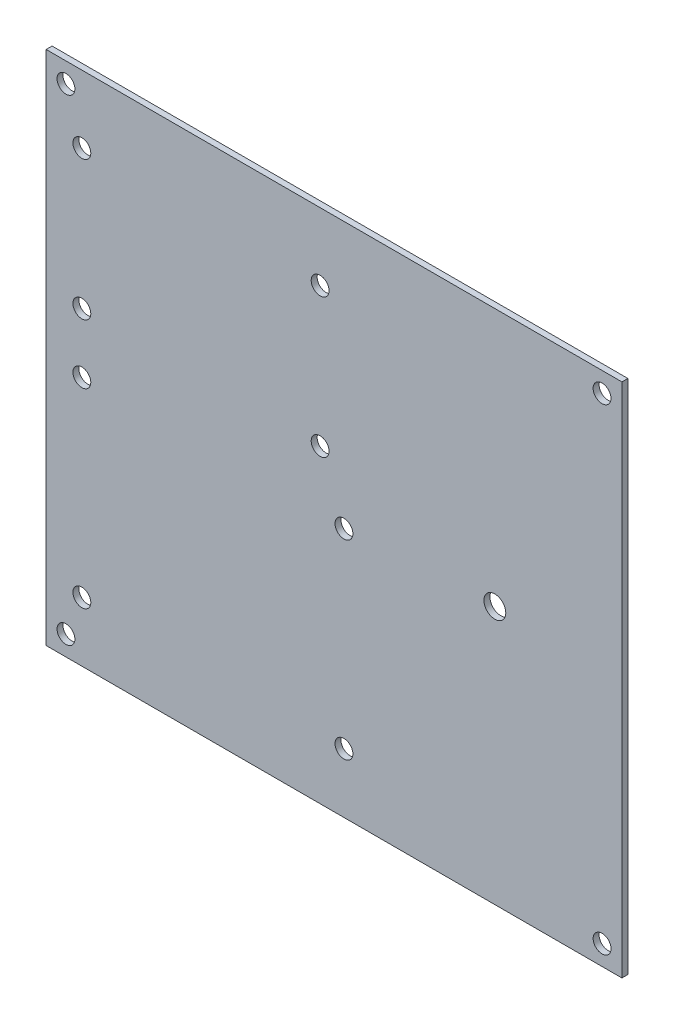
ISO-10303-21;
HEADER;
FILE_DESCRIPTION(('STEP AP214'),'2;1');
FILE_NAME('part.step','',(''),(''),'','','');
FILE_SCHEMA(('AUTOMOTIVE_DESIGN { 1 0 10303 214 1 1 1 1 }'));
ENDSEC;
DATA;
#1=APPLICATION_CONTEXT('core data for automotive mechanical design processes');
#2=APPLICATION_PROTOCOL_DEFINITION('international standard','automotive_design',2000,#1);
#3=PRODUCT_CONTEXT('',#1,'mechanical');
#4=PRODUCT('Part','Part','',(#3));
#5=PRODUCT_RELATED_PRODUCT_CATEGORY('part','',(#4));
#6=PRODUCT_DEFINITION_FORMATION('','',#4);
#7=PRODUCT_DEFINITION_CONTEXT('part definition',#1,'design');
#8=PRODUCT_DEFINITION('design','',#6,#7);
#9=PRODUCT_DEFINITION_SHAPE('','',#8);
#10=(LENGTH_UNIT() NAMED_UNIT(*) SI_UNIT(.MILLI.,.METRE.));
#11=(NAMED_UNIT(*) PLANE_ANGLE_UNIT() SI_UNIT($,.RADIAN.));
#12=(NAMED_UNIT(*) SI_UNIT($,.STERADIAN.) SOLID_ANGLE_UNIT());
#13=UNCERTAINTY_MEASURE_WITH_UNIT(LENGTH_MEASURE(1.E-05),#10,'distance_accuracy_value','');
#14=(GEOMETRIC_REPRESENTATION_CONTEXT(3) GLOBAL_UNCERTAINTY_ASSIGNED_CONTEXT((#13)) GLOBAL_UNIT_ASSIGNED_CONTEXT((#10,
#11,#12)) REPRESENTATION_CONTEXT('',''));
#15=CARTESIAN_POINT('',(0.,0.,0.));
#16=DIRECTION('',(0.,0.,1.));
#17=DIRECTION('',(1.,0.,0.));
#18=AXIS2_PLACEMENT_3D('',#15,#16,#17);
#19=CARTESIAN_POINT('',(-72.5,-65.,1.5));
#20=DIRECTION('',(0.,0.,-1.));
#21=DIRECTION('',(-1.,0.,0.));
#22=AXIS2_PLACEMENT_3D('',#19,#20,#21);
#23=PLANE('',#22);
#24=CARTESIAN_POINT('',(-3.49999999999999,13.,1.5));
#25=DIRECTION('',(0.,0.,1.));
#26=DIRECTION('',(1.,0.,0.));
#27=AXIS2_PLACEMENT_3D('',#24,#25,#26);
#28=CIRCLE('',#27,2.25);
#29=CARTESIAN_POINT('',(-1.24999999999999,13.,1.5));
#30=VERTEX_POINT('',#29);
#31=EDGE_CURVE('E175',#30,#30,#28,.T.);
#32=ORIENTED_EDGE('',*,*,#31,.F.);
#33=EDGE_LOOP('',(#32));
#34=FACE_BOUND('',#33,.T.);
#35=CARTESIAN_POINT('',(-63.5,13.,1.5));
#36=DIRECTION('',(0.,0.,1.));
#37=DIRECTION('',(1.,0.,0.));
#38=AXIS2_PLACEMENT_3D('',#35,#36,#37);
#39=CIRCLE('',#38,2.25);
#40=CARTESIAN_POINT('',(-61.25,13.,1.5));
#41=VERTEX_POINT('',#40);
#42=EDGE_CURVE('E163',#41,#41,#39,.T.);
#43=ORIENTED_EDGE('',*,*,#42,.F.);
#44=EDGE_LOOP('',(#43));
#45=FACE_BOUND('',#44,.T.);
#46=CARTESIAN_POINT('',(2.50000000000002,-50.,1.5));
#47=DIRECTION('',(0.,0.,1.));
#48=DIRECTION('',(-1.,0.,0.));
#49=AXIS2_PLACEMENT_3D('',#46,#47,#48);
#50=CIRCLE('',#49,2.25);
#51=CARTESIAN_POINT('',(0.250000000000013,-50.,1.5));
#52=VERTEX_POINT('',#51);
#53=EDGE_CURVE('E151',#52,#52,#50,.T.);
#54=ORIENTED_EDGE('',*,*,#53,.F.);
#55=EDGE_LOOP('',(#54));
#56=FACE_BOUND('',#55,.T.);
#57=CARTESIAN_POINT('',(-63.5,-50.,1.5));
#58=DIRECTION('',(0.,0.,1.));
#59=DIRECTION('',(-1.,0.,0.));
#60=AXIS2_PLACEMENT_3D('',#57,#58,#59);
#61=CIRCLE('',#60,2.25);
#62=CARTESIAN_POINT('',(-65.75,-50.,1.5));
#63=VERTEX_POINT('',#62);
#64=EDGE_CURVE('E139',#63,#63,#61,.T.);
#65=ORIENTED_EDGE('',*,*,#64,.F.);
#66=EDGE_LOOP('',(#65));
#67=FACE_BOUND('',#66,.T.);
#68=CARTESIAN_POINT('',(67.5,60.,1.5));
#69=DIRECTION('',(0.,0.,1.));
#70=DIRECTION('',(-1.,0.,0.));
#71=AXIS2_PLACEMENT_3D('',#68,#69,#70);
#72=CIRCLE('',#71,2.25);
#73=CARTESIAN_POINT('',(65.25,60.,1.5));
#74=VERTEX_POINT('',#73);
#75=EDGE_CURVE('E127',#74,#74,#72,.T.);
#76=ORIENTED_EDGE('',*,*,#75,.F.);
#77=EDGE_LOOP('',(#76));
#78=FACE_BOUND('',#77,.T.);
#79=CARTESIAN_POINT('',(-67.5,-60.,1.5));
#80=DIRECTION('',(0.,0.,1.));
#81=DIRECTION('',(-1.,0.,0.));
#82=AXIS2_PLACEMENT_3D('',#79,#80,#81);
#83=CIRCLE('',#82,2.25);
#84=CARTESIAN_POINT('',(-69.75,-60.,1.5));
#85=VERTEX_POINT('',#84);
#86=EDGE_CURVE('E115',#85,#85,#83,.T.);
#87=ORIENTED_EDGE('',*,*,#86,.F.);
#88=EDGE_LOOP('',(#87));
#89=FACE_BOUND('',#88,.T.);
#90=DIRECTION('',(0.,-1.,0.));
#91=VECTOR('',#90,1.);
#92=CARTESIAN_POINT('',(-72.5,-65.,1.5));
#93=LINE('',#92,#91);
#94=CARTESIAN_POINT('',(-72.5,65.,1.5));
#95=VERTEX_POINT('',#94);
#96=CARTESIAN_POINT('',(-72.5,-65.,1.5));
#97=VERTEX_POINT('',#96);
#98=EDGE_CURVE('E85',#95,#97,#93,.T.);
#99=ORIENTED_EDGE('',*,*,#98,.T.);
#100=DIRECTION('',(1.,0.,0.));
#101=VECTOR('',#100,1.);
#102=CARTESIAN_POINT('',(-72.5,-65.,1.5));
#103=LINE('',#102,#101);
#104=CARTESIAN_POINT('',(72.5,-65.,1.5));
#105=VERTEX_POINT('',#104);
#106=EDGE_CURVE('E80',#97,#105,#103,.T.);
#107=ORIENTED_EDGE('',*,*,#106,.T.);
#108=DIRECTION('',(0.,1.,0.));
#109=VECTOR('',#108,1.);
#110=CARTESIAN_POINT('',(72.5,-65.,1.5));
#111=LINE('',#110,#109);
#112=CARTESIAN_POINT('',(72.5,65.,1.5));
#113=VERTEX_POINT('',#112);
#114=EDGE_CURVE('E83',#105,#113,#111,.T.);
#115=ORIENTED_EDGE('',*,*,#114,.T.);
#116=DIRECTION('',(-1.,0.,0.));
#117=VECTOR('',#116,1.);
#118=CARTESIAN_POINT('',(-72.5,65.,1.5));
#119=LINE('',#118,#117);
#120=EDGE_CURVE('E50',#113,#95,#119,.T.);
#121=ORIENTED_EDGE('',*,*,#120,.T.);
#122=EDGE_LOOP('',(#99,#107,#115,#121));
#123=FACE_BOUND('',#122,.T.);
#124=CARTESIAN_POINT('',(-67.5,60.,1.5));
#125=DIRECTION('',(0.,0.,1.));
#126=DIRECTION('',(1.,0.,0.));
#127=AXIS2_PLACEMENT_3D('',#124,#125,#126);
#128=CIRCLE('',#127,2.25);
#129=CARTESIAN_POINT('',(-65.25,60.,1.5));
#130=VERTEX_POINT('',#129);
#131=EDGE_CURVE('E100',#130,#130,#128,.T.);
#132=ORIENTED_EDGE('',*,*,#131,.F.);
#133=EDGE_LOOP('',(#132));
#134=FACE_BOUND('',#133,.T.);
#135=CARTESIAN_POINT('',(67.5,-60.,1.5));
#136=DIRECTION('',(0.,0.,1.));
#137=DIRECTION('',(1.,0.,0.));
#138=AXIS2_PLACEMENT_3D('',#135,#136,#137);
#139=CIRCLE('',#138,2.25);
#140=CARTESIAN_POINT('',(69.75,-60.,1.5));
#141=VERTEX_POINT('',#140);
#142=EDGE_CURVE('E121',#141,#141,#139,.T.);
#143=ORIENTED_EDGE('',*,*,#142,.F.);
#144=EDGE_LOOP('',(#143));
#145=FACE_BOUND('',#144,.T.);
#146=CARTESIAN_POINT('',(-63.5,-2.00000000000001,1.5));
#147=DIRECTION('',(0.,0.,1.));
#148=DIRECTION('',(1.,0.,0.));
#149=AXIS2_PLACEMENT_3D('',#146,#147,#148);
#150=CIRCLE('',#149,2.25);
#151=CARTESIAN_POINT('',(-61.25,-2.00000000000001,1.5));
#152=VERTEX_POINT('',#151);
#153=EDGE_CURVE('E133',#152,#152,#150,.T.);
#154=ORIENTED_EDGE('',*,*,#153,.F.);
#155=EDGE_LOOP('',(#154));
#156=FACE_BOUND('',#155,.T.);
#157=CARTESIAN_POINT('',(2.50000000000002,-2.,1.5));
#158=DIRECTION('',(0.,0.,1.));
#159=DIRECTION('',(1.,0.,0.));
#160=AXIS2_PLACEMENT_3D('',#157,#158,#159);
#161=CIRCLE('',#160,2.25);
#162=CARTESIAN_POINT('',(4.75000000000001,-2.,1.5));
#163=VERTEX_POINT('',#162);
#164=EDGE_CURVE('E145',#163,#163,#161,.T.);
#165=ORIENTED_EDGE('',*,*,#164,.F.);
#166=EDGE_LOOP('',(#165));
#167=FACE_BOUND('',#166,.T.);
#168=CARTESIAN_POINT('',(40.5,0.,1.5));
#169=DIRECTION('',(0.,0.,1.));
#170=DIRECTION('',(1.,0.,0.));
#171=AXIS2_PLACEMENT_3D('',#168,#169,#170);
#172=CIRCLE('',#171,2.75);
#173=CARTESIAN_POINT('',(43.25,0.,1.5));
#174=VERTEX_POINT('',#173);
#175=EDGE_CURVE('E157',#174,#174,#172,.T.);
#176=ORIENTED_EDGE('',*,*,#175,.F.);
#177=EDGE_LOOP('',(#176));
#178=FACE_BOUND('',#177,.T.);
#179=CARTESIAN_POINT('',(-63.5,48.,1.5));
#180=DIRECTION('',(0.,0.,1.));
#181=DIRECTION('',(1.,0.,0.));
#182=AXIS2_PLACEMENT_3D('',#179,#180,#181);
#183=CIRCLE('',#182,2.25);
#184=CARTESIAN_POINT('',(-61.25,48.,1.5));
#185=VERTEX_POINT('',#184);
#186=EDGE_CURVE('E169',#185,#185,#183,.T.);
#187=ORIENTED_EDGE('',*,*,#186,.F.);
#188=EDGE_LOOP('',(#187));
#189=FACE_BOUND('',#188,.T.);
#190=CARTESIAN_POINT('',(-3.49999999999999,48.,1.5));
#191=DIRECTION('',(0.,0.,1.));
#192=DIRECTION('',(1.,0.,0.));
#193=AXIS2_PLACEMENT_3D('',#190,#191,#192);
#194=CIRCLE('',#193,2.25);
#195=CARTESIAN_POINT('',(-1.24999999999999,48.,1.5));
#196=VERTEX_POINT('',#195);
#197=EDGE_CURVE('E181',#196,#196,#194,.T.);
#198=ORIENTED_EDGE('',*,*,#197,.F.);
#199=EDGE_LOOP('',(#198));
#200=FACE_BOUND('',#199,.T.);
#201=ADVANCED_FACE('F33',(#34,#45,#56,#67,#78,#89,#123,#134,#145,#156,#167,#178,#189,#200),#23,.F.);
#202=CARTESIAN_POINT('',(-72.5,-65.,0.));
#203=DIRECTION('',(0.,0.,-1.));
#204=DIRECTION('',(-1.,0.,0.));
#205=AXIS2_PLACEMENT_3D('',#202,#203,#204);
#206=PLANE('',#205);
#207=CARTESIAN_POINT('',(-3.49999999999999,13.,0.));
#208=DIRECTION('',(0.,0.,1.));
#209=DIRECTION('',(1.,0.,0.));
#210=AXIS2_PLACEMENT_3D('',#207,#208,#209);
#211=CIRCLE('',#210,2.25);
#212=CARTESIAN_POINT('',(-1.24999999999999,13.,0.));
#213=VERTEX_POINT('',#212);
#214=EDGE_CURVE('E178',#213,#213,#211,.T.);
#215=ORIENTED_EDGE('',*,*,#214,.T.);
#216=EDGE_LOOP('',(#215));
#217=FACE_BOUND('',#216,.T.);
#218=CARTESIAN_POINT('',(-63.5,13.,0.));
#219=DIRECTION('',(0.,0.,1.));
#220=DIRECTION('',(1.,0.,0.));
#221=AXIS2_PLACEMENT_3D('',#218,#219,#220);
#222=CIRCLE('',#221,2.25);
#223=CARTESIAN_POINT('',(-61.25,13.,0.));
#224=VERTEX_POINT('',#223);
#225=EDGE_CURVE('E166',#224,#224,#222,.T.);
#226=ORIENTED_EDGE('',*,*,#225,.T.);
#227=EDGE_LOOP('',(#226));
#228=FACE_BOUND('',#227,.T.);
#229=CARTESIAN_POINT('',(2.50000000000002,-50.,0.));
#230=DIRECTION('',(0.,0.,1.));
#231=DIRECTION('',(-1.,0.,0.));
#232=AXIS2_PLACEMENT_3D('',#229,#230,#231);
#233=CIRCLE('',#232,2.25);
#234=CARTESIAN_POINT('',(0.250000000000013,-50.,0.));
#235=VERTEX_POINT('',#234);
#236=EDGE_CURVE('E154',#235,#235,#233,.T.);
#237=ORIENTED_EDGE('',*,*,#236,.T.);
#238=EDGE_LOOP('',(#237));
#239=FACE_BOUND('',#238,.T.);
#240=CARTESIAN_POINT('',(-63.5,-50.,0.));
#241=DIRECTION('',(0.,0.,1.));
#242=DIRECTION('',(-1.,0.,0.));
#243=AXIS2_PLACEMENT_3D('',#240,#241,#242);
#244=CIRCLE('',#243,2.25);
#245=CARTESIAN_POINT('',(-65.75,-50.,0.));
#246=VERTEX_POINT('',#245);
#247=EDGE_CURVE('E142',#246,#246,#244,.T.);
#248=ORIENTED_EDGE('',*,*,#247,.T.);
#249=EDGE_LOOP('',(#248));
#250=FACE_BOUND('',#249,.T.);
#251=CARTESIAN_POINT('',(67.5,60.,0.));
#252=DIRECTION('',(0.,0.,1.));
#253=DIRECTION('',(-1.,0.,0.));
#254=AXIS2_PLACEMENT_3D('',#251,#252,#253);
#255=CIRCLE('',#254,2.25);
#256=CARTESIAN_POINT('',(65.25,60.,0.));
#257=VERTEX_POINT('',#256);
#258=EDGE_CURVE('E130',#257,#257,#255,.T.);
#259=ORIENTED_EDGE('',*,*,#258,.T.);
#260=EDGE_LOOP('',(#259));
#261=FACE_BOUND('',#260,.T.);
#262=CARTESIAN_POINT('',(-67.5,-60.,0.));
#263=DIRECTION('',(0.,0.,1.));
#264=DIRECTION('',(-1.,0.,0.));
#265=AXIS2_PLACEMENT_3D('',#262,#263,#264);
#266=CIRCLE('',#265,2.25);
#267=CARTESIAN_POINT('',(-69.75,-60.,0.));
#268=VERTEX_POINT('',#267);
#269=EDGE_CURVE('E118',#268,#268,#266,.T.);
#270=ORIENTED_EDGE('',*,*,#269,.T.);
#271=EDGE_LOOP('',(#270));
#272=FACE_BOUND('',#271,.T.);
#273=DIRECTION('',(0.,-1.,0.));
#274=VECTOR('',#273,1.);
#275=CARTESIAN_POINT('',(-72.5,-65.,0.));
#276=LINE('',#275,#274);
#277=CARTESIAN_POINT('',(-72.5,65.,0.));
#278=VERTEX_POINT('',#277);
#279=CARTESIAN_POINT('',(-72.5,-65.,0.));
#280=VERTEX_POINT('',#279);
#281=EDGE_CURVE('E97',#278,#280,#276,.T.);
#282=ORIENTED_EDGE('',*,*,#281,.F.);
#283=DIRECTION('',(-1.,0.,0.));
#284=VECTOR('',#283,1.);
#285=CARTESIAN_POINT('',(-72.5,65.,0.));
#286=LINE('',#285,#284);
#287=CARTESIAN_POINT('',(72.5,65.,0.));
#288=VERTEX_POINT('',#287);
#289=EDGE_CURVE('E73',#288,#278,#286,.T.);
#290=ORIENTED_EDGE('',*,*,#289,.F.);
#291=DIRECTION('',(0.,1.,0.));
#292=VECTOR('',#291,1.);
#293=CARTESIAN_POINT('',(72.5,-65.,0.));
#294=LINE('',#293,#292);
#295=CARTESIAN_POINT('',(72.5,-65.,0.));
#296=VERTEX_POINT('',#295);
#297=EDGE_CURVE('E67',#296,#288,#294,.T.);
#298=ORIENTED_EDGE('',*,*,#297,.F.);
#299=DIRECTION('',(1.,0.,0.));
#300=VECTOR('',#299,1.);
#301=CARTESIAN_POINT('',(-72.5,-65.,0.));
#302=LINE('',#301,#300);
#303=EDGE_CURVE('E89',#280,#296,#302,.T.);
#304=ORIENTED_EDGE('',*,*,#303,.F.);
#305=EDGE_LOOP('',(#282,#290,#298,#304));
#306=FACE_BOUND('',#305,.T.);
#307=CARTESIAN_POINT('',(-67.5,60.,0.));
#308=DIRECTION('',(0.,0.,1.));
#309=DIRECTION('',(1.,0.,0.));
#310=AXIS2_PLACEMENT_3D('',#307,#308,#309);
#311=CIRCLE('',#310,2.25);
#312=CARTESIAN_POINT('',(-65.25,60.,0.));
#313=VERTEX_POINT('',#312);
#314=EDGE_CURVE('E112',#313,#313,#311,.T.);
#315=ORIENTED_EDGE('',*,*,#314,.T.);
#316=EDGE_LOOP('',(#315));
#317=FACE_BOUND('',#316,.T.);
#318=CARTESIAN_POINT('',(67.5,-60.,0.));
#319=DIRECTION('',(0.,0.,1.));
#320=DIRECTION('',(1.,0.,0.));
#321=AXIS2_PLACEMENT_3D('',#318,#319,#320);
#322=CIRCLE('',#321,2.25);
#323=CARTESIAN_POINT('',(69.75,-60.,0.));
#324=VERTEX_POINT('',#323);
#325=EDGE_CURVE('E124',#324,#324,#322,.T.);
#326=ORIENTED_EDGE('',*,*,#325,.T.);
#327=EDGE_LOOP('',(#326));
#328=FACE_BOUND('',#327,.T.);
#329=CARTESIAN_POINT('',(-63.5,-2.00000000000001,0.));
#330=DIRECTION('',(0.,0.,1.));
#331=DIRECTION('',(1.,0.,0.));
#332=AXIS2_PLACEMENT_3D('',#329,#330,#331);
#333=CIRCLE('',#332,2.25);
#334=CARTESIAN_POINT('',(-61.25,-2.00000000000001,0.));
#335=VERTEX_POINT('',#334);
#336=EDGE_CURVE('E136',#335,#335,#333,.T.);
#337=ORIENTED_EDGE('',*,*,#336,.T.);
#338=EDGE_LOOP('',(#337));
#339=FACE_BOUND('',#338,.T.);
#340=CARTESIAN_POINT('',(2.50000000000002,-2.,0.));
#341=DIRECTION('',(0.,0.,1.));
#342=DIRECTION('',(1.,0.,0.));
#343=AXIS2_PLACEMENT_3D('',#340,#341,#342);
#344=CIRCLE('',#343,2.25);
#345=CARTESIAN_POINT('',(4.75000000000001,-2.,0.));
#346=VERTEX_POINT('',#345);
#347=EDGE_CURVE('E148',#346,#346,#344,.T.);
#348=ORIENTED_EDGE('',*,*,#347,.T.);
#349=EDGE_LOOP('',(#348));
#350=FACE_BOUND('',#349,.T.);
#351=CARTESIAN_POINT('',(40.5,0.,0.));
#352=DIRECTION('',(0.,0.,1.));
#353=DIRECTION('',(1.,0.,0.));
#354=AXIS2_PLACEMENT_3D('',#351,#352,#353);
#355=CIRCLE('',#354,2.75);
#356=CARTESIAN_POINT('',(43.25,0.,0.));
#357=VERTEX_POINT('',#356);
#358=EDGE_CURVE('E160',#357,#357,#355,.T.);
#359=ORIENTED_EDGE('',*,*,#358,.T.);
#360=EDGE_LOOP('',(#359));
#361=FACE_BOUND('',#360,.T.);
#362=CARTESIAN_POINT('',(-63.5,48.,0.));
#363=DIRECTION('',(0.,0.,1.));
#364=DIRECTION('',(1.,0.,0.));
#365=AXIS2_PLACEMENT_3D('',#362,#363,#364);
#366=CIRCLE('',#365,2.25);
#367=CARTESIAN_POINT('',(-61.25,48.,0.));
#368=VERTEX_POINT('',#367);
#369=EDGE_CURVE('E172',#368,#368,#366,.T.);
#370=ORIENTED_EDGE('',*,*,#369,.T.);
#371=EDGE_LOOP('',(#370));
#372=FACE_BOUND('',#371,.T.);
#373=CARTESIAN_POINT('',(-3.49999999999999,48.,0.));
#374=DIRECTION('',(0.,0.,1.));
#375=DIRECTION('',(1.,0.,0.));
#376=AXIS2_PLACEMENT_3D('',#373,#374,#375);
#377=CIRCLE('',#376,2.25);
#378=CARTESIAN_POINT('',(-1.24999999999999,48.,0.));
#379=VERTEX_POINT('',#378);
#380=EDGE_CURVE('E184',#379,#379,#377,.T.);
#381=ORIENTED_EDGE('',*,*,#380,.T.);
#382=EDGE_LOOP('',(#381));
#383=FACE_BOUND('',#382,.T.);
#384=ADVANCED_FACE('F108',(#217,#228,#239,#250,#261,#272,#306,#317,#328,#339,#350,#361,#372,
#383),#206,.T.);
#385=CARTESIAN_POINT('',(-72.5,-65.,1.5));
#386=DIRECTION('',(1.,0.,0.));
#387=DIRECTION('',(0.,1.,0.));
#388=AXIS2_PLACEMENT_3D('',#385,#386,#387);
#389=PLANE('',#388);
#390=ORIENTED_EDGE('',*,*,#281,.T.);
#391=DIRECTION('',(0.,0.,-1.));
#392=VECTOR('',#391,1.);
#393=CARTESIAN_POINT('',(-72.5,-65.,1.5));
#394=LINE('',#393,#392);
#395=EDGE_CURVE('E11',#97,#280,#394,.T.);
#396=ORIENTED_EDGE('',*,*,#395,.F.);
#397=ORIENTED_EDGE('',*,*,#98,.F.);
#398=DIRECTION('',(0.,0.,-1.));
#399=VECTOR('',#398,1.);
#400=CARTESIAN_POINT('',(-72.5,65.,1.5));
#401=LINE('',#400,#399);
#402=EDGE_CURVE('E93',#95,#278,#401,.T.);
#403=ORIENTED_EDGE('',*,*,#402,.T.);
#404=EDGE_LOOP('',(#390,#396,#397,#403));
#405=FACE_BOUND('',#404,.T.);
#406=ADVANCED_FACE('F35',(#405),#389,.F.);
#407=CARTESIAN_POINT('',(-72.5,-65.,1.5));
#408=DIRECTION('',(0.,1.,0.));
#409=DIRECTION('',(-1.,0.,0.));
#410=AXIS2_PLACEMENT_3D('',#407,#408,#409);
#411=PLANE('',#410);
#412=ORIENTED_EDGE('',*,*,#303,.T.);
#413=DIRECTION('',(0.,0.,-1.));
#414=VECTOR('',#413,1.);
#415=CARTESIAN_POINT('',(72.5,-65.,1.5));
#416=LINE('',#415,#414);
#417=EDGE_CURVE('E42',#105,#296,#416,.T.);
#418=ORIENTED_EDGE('',*,*,#417,.F.);
#419=ORIENTED_EDGE('',*,*,#106,.F.);
#420=ORIENTED_EDGE('',*,*,#395,.T.);
#421=EDGE_LOOP('',(#412,#418,#419,#420));
#422=FACE_BOUND('',#421,.T.);
#423=ADVANCED_FACE('F88',(#422),#411,.F.);
#424=CARTESIAN_POINT('',(72.5,-65.,1.5));
#425=DIRECTION('',(-1.,0.,0.));
#426=DIRECTION('',(0.,-1.,0.));
#427=AXIS2_PLACEMENT_3D('',#424,#425,#426);
#428=PLANE('',#427);
#429=ORIENTED_EDGE('',*,*,#297,.T.);
#430=DIRECTION('',(0.,0.,-1.));
#431=VECTOR('',#430,1.);
#432=CARTESIAN_POINT('',(72.5,65.,1.5));
#433=LINE('',#432,#431);
#434=EDGE_CURVE('E90',#113,#288,#433,.T.);
#435=ORIENTED_EDGE('',*,*,#434,.F.);
#436=ORIENTED_EDGE('',*,*,#114,.F.);
#437=ORIENTED_EDGE('',*,*,#417,.T.);
#438=EDGE_LOOP('',(#429,#435,#436,#437));
#439=FACE_BOUND('',#438,.T.);
#440=ADVANCED_FACE('F91',(#439),#428,.F.);
#441=CARTESIAN_POINT('',(-72.5,65.,1.5));
#442=DIRECTION('',(0.,-1.,0.));
#443=DIRECTION('',(0.,0.,-1.));
#444=AXIS2_PLACEMENT_3D('',#441,#442,#443);
#445=PLANE('',#444);
#446=ORIENTED_EDGE('',*,*,#289,.T.);
#447=ORIENTED_EDGE('',*,*,#402,.F.);
#448=ORIENTED_EDGE('',*,*,#120,.F.);
#449=ORIENTED_EDGE('',*,*,#434,.T.);
#450=EDGE_LOOP('',(#446,#447,#448,#449));
#451=FACE_BOUND('',#450,.T.);
#452=ADVANCED_FACE('F105',(#451),#445,.F.);
#453=CARTESIAN_POINT('',(-67.5,60.,1.5));
#454=DIRECTION('',(0.,0.,-1.));
#455=DIRECTION('',(-1.,0.,0.));
#456=AXIS2_PLACEMENT_3D('',#453,#454,#455);
#457=CYLINDRICAL_SURFACE('',#456,2.25);
#458=ORIENTED_EDGE('',*,*,#131,.T.);
#459=EDGE_LOOP('',(#458));
#460=FACE_BOUND('',#459,.T.);
#461=ORIENTED_EDGE('',*,*,#314,.F.);
#462=EDGE_LOOP('',(#461));
#463=FACE_BOUND('',#462,.T.);
#464=ADVANCED_FACE('F204',(#460,#463),#457,.F.);
#465=CARTESIAN_POINT('',(-67.5,-60.,1.5));
#466=DIRECTION('',(0.,0.,-1.));
#467=DIRECTION('',(-1.,0.,0.));
#468=AXIS2_PLACEMENT_3D('',#465,#466,#467);
#469=CYLINDRICAL_SURFACE('',#468,2.25);
#470=ORIENTED_EDGE('',*,*,#86,.T.);
#471=EDGE_LOOP('',(#470));
#472=FACE_BOUND('',#471,.T.);
#473=ORIENTED_EDGE('',*,*,#269,.F.);
#474=EDGE_LOOP('',(#473));
#475=FACE_BOUND('',#474,.T.);
#476=ADVANCED_FACE('F250',(#472,#475),#469,.F.);
#477=CARTESIAN_POINT('',(67.5,-60.,1.5));
#478=DIRECTION('',(0.,0.,-1.));
#479=DIRECTION('',(-1.,0.,0.));
#480=AXIS2_PLACEMENT_3D('',#477,#478,#479);
#481=CYLINDRICAL_SURFACE('',#480,2.25);
#482=ORIENTED_EDGE('',*,*,#142,.T.);
#483=EDGE_LOOP('',(#482));
#484=FACE_BOUND('',#483,.T.);
#485=ORIENTED_EDGE('',*,*,#325,.F.);
#486=EDGE_LOOP('',(#485));
#487=FACE_BOUND('',#486,.T.);
#488=ADVANCED_FACE('F258',(#484,#487),#481,.F.);
#489=CARTESIAN_POINT('',(67.5,60.,1.5));
#490=DIRECTION('',(0.,0.,-1.));
#491=DIRECTION('',(-1.,0.,0.));
#492=AXIS2_PLACEMENT_3D('',#489,#490,#491);
#493=CYLINDRICAL_SURFACE('',#492,2.25);
#494=ORIENTED_EDGE('',*,*,#75,.T.);
#495=EDGE_LOOP('',(#494));
#496=FACE_BOUND('',#495,.T.);
#497=ORIENTED_EDGE('',*,*,#258,.F.);
#498=EDGE_LOOP('',(#497));
#499=FACE_BOUND('',#498,.T.);
#500=ADVANCED_FACE('F266',(#496,#499),#493,.F.);
#501=CARTESIAN_POINT('',(-63.5,-2.00000000000001,1.5));
#502=DIRECTION('',(0.,0.,-1.));
#503=DIRECTION('',(-1.,0.,0.));
#504=AXIS2_PLACEMENT_3D('',#501,#502,#503);
#505=CYLINDRICAL_SURFACE('',#504,2.25);
#506=ORIENTED_EDGE('',*,*,#153,.T.);
#507=EDGE_LOOP('',(#506));
#508=FACE_BOUND('',#507,.T.);
#509=ORIENTED_EDGE('',*,*,#336,.F.);
#510=EDGE_LOOP('',(#509));
#511=FACE_BOUND('',#510,.T.);
#512=ADVANCED_FACE('F275',(#508,#511),#505,.F.);
#513=CARTESIAN_POINT('',(-63.5,-50.,1.5));
#514=DIRECTION('',(0.,0.,-1.));
#515=DIRECTION('',(-1.,0.,0.));
#516=AXIS2_PLACEMENT_3D('',#513,#514,#515);
#517=CYLINDRICAL_SURFACE('',#516,2.25);
#518=ORIENTED_EDGE('',*,*,#64,.T.);
#519=EDGE_LOOP('',(#518));
#520=FACE_BOUND('',#519,.T.);
#521=ORIENTED_EDGE('',*,*,#247,.F.);
#522=EDGE_LOOP('',(#521));
#523=FACE_BOUND('',#522,.T.);
#524=ADVANCED_FACE('F284',(#520,#523),#517,.F.);
#525=CARTESIAN_POINT('',(2.50000000000002,-2.,1.5));
#526=DIRECTION('',(0.,0.,-1.));
#527=DIRECTION('',(-1.,0.,0.));
#528=AXIS2_PLACEMENT_3D('',#525,#526,#527);
#529=CYLINDRICAL_SURFACE('',#528,2.25);
#530=ORIENTED_EDGE('',*,*,#164,.T.);
#531=EDGE_LOOP('',(#530));
#532=FACE_BOUND('',#531,.T.);
#533=ORIENTED_EDGE('',*,*,#347,.F.);
#534=EDGE_LOOP('',(#533));
#535=FACE_BOUND('',#534,.T.);
#536=ADVANCED_FACE('F293',(#532,#535),#529,.F.);
#537=CARTESIAN_POINT('',(2.50000000000002,-50.,1.5));
#538=DIRECTION('',(0.,0.,-1.));
#539=DIRECTION('',(-1.,0.,0.));
#540=AXIS2_PLACEMENT_3D('',#537,#538,#539);
#541=CYLINDRICAL_SURFACE('',#540,2.25);
#542=ORIENTED_EDGE('',*,*,#53,.T.);
#543=EDGE_LOOP('',(#542));
#544=FACE_BOUND('',#543,.T.);
#545=ORIENTED_EDGE('',*,*,#236,.F.);
#546=EDGE_LOOP('',(#545));
#547=FACE_BOUND('',#546,.T.);
#548=ADVANCED_FACE('F302',(#544,#547),#541,.F.);
#549=CARTESIAN_POINT('',(40.5,0.,1.5));
#550=DIRECTION('',(0.,0.,-1.));
#551=DIRECTION('',(-1.,0.,0.));
#552=AXIS2_PLACEMENT_3D('',#549,#550,#551);
#553=CYLINDRICAL_SURFACE('',#552,2.75);
#554=ORIENTED_EDGE('',*,*,#175,.T.);
#555=EDGE_LOOP('',(#554));
#556=FACE_BOUND('',#555,.T.);
#557=ORIENTED_EDGE('',*,*,#358,.F.);
#558=EDGE_LOOP('',(#557));
#559=FACE_BOUND('',#558,.T.);
#560=ADVANCED_FACE('F311',(#556,#559),#553,.F.);
#561=CARTESIAN_POINT('',(-63.5,13.,1.5));
#562=DIRECTION('',(0.,0.,-1.));
#563=DIRECTION('',(-1.,0.,0.));
#564=AXIS2_PLACEMENT_3D('',#561,#562,#563);
#565=CYLINDRICAL_SURFACE('',#564,2.25);
#566=ORIENTED_EDGE('',*,*,#42,.T.);
#567=EDGE_LOOP('',(#566));
#568=FACE_BOUND('',#567,.T.);
#569=ORIENTED_EDGE('',*,*,#225,.F.);
#570=EDGE_LOOP('',(#569));
#571=FACE_BOUND('',#570,.T.);
#572=ADVANCED_FACE('F320',(#568,#571),#565,.F.);
#573=CARTESIAN_POINT('',(-63.5,48.,1.5));
#574=DIRECTION('',(0.,0.,-1.));
#575=DIRECTION('',(-1.,0.,0.));
#576=AXIS2_PLACEMENT_3D('',#573,#574,#575);
#577=CYLINDRICAL_SURFACE('',#576,2.25);
#578=ORIENTED_EDGE('',*,*,#186,.T.);
#579=EDGE_LOOP('',(#578));
#580=FACE_BOUND('',#579,.T.);
#581=ORIENTED_EDGE('',*,*,#369,.F.);
#582=EDGE_LOOP('',(#581));
#583=FACE_BOUND('',#582,.T.);
#584=ADVANCED_FACE('F329',(#580,#583),#577,.F.);
#585=CARTESIAN_POINT('',(-3.49999999999999,13.,1.5));
#586=DIRECTION('',(0.,0.,-1.));
#587=DIRECTION('',(-1.,0.,0.));
#588=AXIS2_PLACEMENT_3D('',#585,#586,#587);
#589=CYLINDRICAL_SURFACE('',#588,2.25);
#590=ORIENTED_EDGE('',*,*,#31,.T.);
#591=EDGE_LOOP('',(#590));
#592=FACE_BOUND('',#591,.T.);
#593=ORIENTED_EDGE('',*,*,#214,.F.);
#594=EDGE_LOOP('',(#593));
#595=FACE_BOUND('',#594,.T.);
#596=ADVANCED_FACE('F338',(#592,#595),#589,.F.);
#597=CARTESIAN_POINT('',(-3.49999999999999,48.,1.5));
#598=DIRECTION('',(0.,0.,-1.));
#599=DIRECTION('',(-1.,0.,0.));
#600=AXIS2_PLACEMENT_3D('',#597,#598,#599);
#601=CYLINDRICAL_SURFACE('',#600,2.25);
#602=ORIENTED_EDGE('',*,*,#197,.T.);
#603=EDGE_LOOP('',(#602));
#604=FACE_BOUND('',#603,.T.);
#605=ORIENTED_EDGE('',*,*,#380,.F.);
#606=EDGE_LOOP('',(#605));
#607=FACE_BOUND('',#606,.T.);
#608=ADVANCED_FACE('F190',(#604,#607),#601,.F.);
#609=CLOSED_SHELL('',(#201,#384,#406,#423,#440,#452,#464,#476,#488,#500,#512,#524,#536,#548,
#560,#572,#584,#596,#608));
#610=MANIFOLD_SOLID_BREP('B2',#609);
#611=ADVANCED_BREP_SHAPE_REPRESENTATION('',(#18,#610),#14);
#612=SHAPE_DEFINITION_REPRESENTATION(#9,#611);
ENDSEC;
END-ISO-10303-21;
